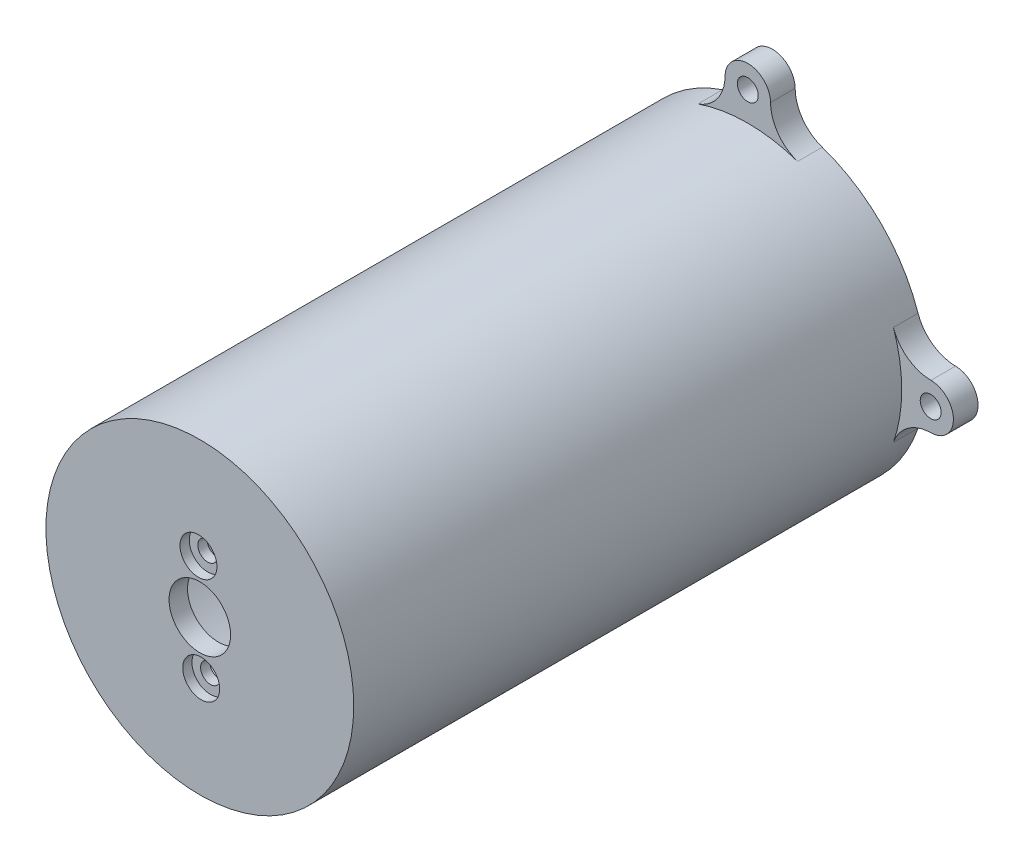
ISO-10303-21;
HEADER;
FILE_DESCRIPTION(('STEP AP214'),'2;1');
FILE_NAME('part.step','',(''),(''),'','','');
FILE_SCHEMA(('AUTOMOTIVE_DESIGN { 1 0 10303 214 1 1 1 1 }'));
ENDSEC;
DATA;
#1=APPLICATION_CONTEXT('core data for automotive mechanical design processes');
#2=APPLICATION_PROTOCOL_DEFINITION('international standard','automotive_design',2000,#1);
#3=PRODUCT_CONTEXT('',#1,'mechanical');
#4=PRODUCT('Part','Part','',(#3));
#5=PRODUCT_RELATED_PRODUCT_CATEGORY('part','',(#4));
#6=PRODUCT_DEFINITION_FORMATION('','',#4);
#7=PRODUCT_DEFINITION_CONTEXT('part definition',#1,'design');
#8=PRODUCT_DEFINITION('design','',#6,#7);
#9=PRODUCT_DEFINITION_SHAPE('','',#8);
#10=(LENGTH_UNIT() NAMED_UNIT(*) SI_UNIT(.MILLI.,.METRE.));
#11=(NAMED_UNIT(*) PLANE_ANGLE_UNIT() SI_UNIT($,.RADIAN.));
#12=(NAMED_UNIT(*) SI_UNIT($,.STERADIAN.) SOLID_ANGLE_UNIT());
#13=UNCERTAINTY_MEASURE_WITH_UNIT(LENGTH_MEASURE(1.E-05),#10,'distance_accuracy_value','');
#14=(GEOMETRIC_REPRESENTATION_CONTEXT(3) GLOBAL_UNCERTAINTY_ASSIGNED_CONTEXT((#13)) GLOBAL_UNIT_ASSIGNED_CONTEXT((#10,
#11,#12)) REPRESENTATION_CONTEXT('',''));
#15=CARTESIAN_POINT('',(0.,0.,0.));
#16=DIRECTION('',(0.,0.,1.));
#17=DIRECTION('',(1.,0.,0.));
#18=AXIS2_PLACEMENT_3D('',#15,#16,#17);
#19=CARTESIAN_POINT('',(0.222147672715695,-8.49709658715891,93.));
#20=DIRECTION('',(0.,0.,-1.));
#21=DIRECTION('',(-1.,0.,0.));
#22=AXIS2_PLACEMENT_3D('',#19,#20,#21);
#23=CYLINDRICAL_SURFACE('',#22,1.60000000000014);
#24=CARTESIAN_POINT('',(0.222147672715695,-8.49709658715891,90.));
#25=DIRECTION('',(0.,0.,1.));
#26=DIRECTION('',(1.,0.,0.));
#27=AXIS2_PLACEMENT_3D('',#24,#25,#26);
#28=CIRCLE('',#27,1.60000000000014);
#29=CARTESIAN_POINT('',(1.82214767271583,-8.49709658715891,90.));
#30=VERTEX_POINT('',#29);
#31=EDGE_CURVE('E297',#30,#30,#28,.T.);
#32=ORIENTED_EDGE('',*,*,#31,.F.);
#33=EDGE_LOOP('',(#32));
#34=FACE_BOUND('',#33,.T.);
#35=CARTESIAN_POINT('',(0.222147672715695,-8.49709658715891,91.5));
#36=DIRECTION('',(0.,0.,1.));
#37=DIRECTION('',(1.,0.,0.));
#38=AXIS2_PLACEMENT_3D('',#35,#36,#37);
#39=CIRCLE('',#38,1.60000000000014);
#40=CARTESIAN_POINT('',(1.82214767271583,-8.49709658715891,91.5));
#41=VERTEX_POINT('',#40);
#42=EDGE_CURVE('E43',#41,#41,#39,.T.);
#43=ORIENTED_EDGE('',*,*,#42,.T.);
#44=EDGE_LOOP('',(#43));
#45=FACE_BOUND('',#44,.T.);
#46=ADVANCED_FACE('F39',(#34,#45),#23,.F.);
#47=CARTESIAN_POINT('',(-0.222147672715639,8.49709658715891,93.));
#48=DIRECTION('',(0.,0.,-1.));
#49=DIRECTION('',(-1.,0.,0.));
#50=AXIS2_PLACEMENT_3D('',#47,#48,#49);
#51=CYLINDRICAL_SURFACE('',#50,1.60000000000014);
#52=CARTESIAN_POINT('',(-0.222147672715639,8.49709658715891,90.));
#53=DIRECTION('',(0.,0.,1.));
#54=DIRECTION('',(1.,0.,0.));
#55=AXIS2_PLACEMENT_3D('',#52,#53,#54);
#56=CIRCLE('',#55,1.60000000000014);
#57=CARTESIAN_POINT('',(1.3778523272845,8.49709658715891,90.));
#58=VERTEX_POINT('',#57);
#59=EDGE_CURVE('E294',#58,#58,#56,.T.);
#60=ORIENTED_EDGE('',*,*,#59,.F.);
#61=EDGE_LOOP('',(#60));
#62=FACE_BOUND('',#61,.T.);
#63=CARTESIAN_POINT('',(-0.222147672715639,8.49709658715891,91.5));
#64=DIRECTION('',(0.,0.,1.));
#65=DIRECTION('',(1.,0.,0.));
#66=AXIS2_PLACEMENT_3D('',#63,#64,#65);
#67=CIRCLE('',#66,1.60000000000014);
#68=CARTESIAN_POINT('',(1.3778523272845,8.49709658715891,91.5));
#69=VERTEX_POINT('',#68);
#70=EDGE_CURVE('E284',#69,#69,#67,.T.);
#71=ORIENTED_EDGE('',*,*,#70,.T.);
#72=EDGE_LOOP('',(#71));
#73=FACE_BOUND('',#72,.T.);
#74=ADVANCED_FACE('F369',(#62,#73),#51,.F.);
#75=CARTESIAN_POINT('',(0.,0.,0.));
#76=DIRECTION('',(0.,0.,1.));
#77=DIRECTION('',(1.,0.,0.));
#78=AXIS2_PLACEMENT_3D('',#75,#76,#77);
#79=PLANE('',#78);
#80=CARTESIAN_POINT('',(0.,0.,0.));
#81=DIRECTION('',(0.,0.,1.));
#82=DIRECTION('',(1.,0.,0.));
#83=AXIS2_PLACEMENT_3D('',#80,#81,#82);
#84=CIRCLE('',#83,25.);
#85=CARTESIAN_POINT('',(23.6554109952273,8.08835772248491,0.));
#86=VERTEX_POINT('',#85);
#87=CARTESIAN_POINT('',(8.08835772248466,23.6554109952273,0.));
#88=VERTEX_POINT('',#87);
#89=EDGE_CURVE('E11',#86,#88,#84,.T.);
#90=ORIENTED_EDGE('',*,*,#89,.F.);
#91=CARTESIAN_POINT('',(29.8058178539863,10.191330730331,0.));
#92=DIRECTION('',(0.,0.,1.));
#93=DIRECTION('',(-1.,0.,0.));
#94=AXIS2_PLACEMENT_3D('',#91,#92,#93);
#95=CIRCLE('',#94,6.5);
#96=CARTESIAN_POINT('',(29.7425959776503,3.69163819957597,0.));
#97=VERTEX_POINT('',#96);
#98=EDGE_CURVE('E240',#86,#97,#95,.T.);
#99=ORIENTED_EDGE('',*,*,#98,.T.);
#100=CARTESIAN_POINT('',(29.706687772358,1.03720345996027E-13,0.));
#101=DIRECTION('',(0.,0.,-1.));
#102=DIRECTION('',(-1.,0.,0.));
#103=AXIS2_PLACEMENT_3D('',#100,#101,#102);
#104=CIRCLE('',#103,3.69181283325347);
#105=CARTESIAN_POINT('',(29.7425959776503,-3.69163819957576,0.));
#106=VERTEX_POINT('',#105);
#107=EDGE_CURVE('E182',#97,#106,#104,.T.);
#108=ORIENTED_EDGE('',*,*,#107,.T.);
#109=CARTESIAN_POINT('',(29.8058178539864,-10.1913307303308,0.));
#110=DIRECTION('',(0.,0.,1.));
#111=DIRECTION('',(1.,0.,0.));
#112=AXIS2_PLACEMENT_3D('',#109,#110,#111);
#113=CIRCLE('',#112,6.5);
#114=CARTESIAN_POINT('',(23.6554109952273,-8.08835772248474,0.));
#115=VERTEX_POINT('',#114);
#116=EDGE_CURVE('E179',#106,#115,#113,.T.);
#117=ORIENTED_EDGE('',*,*,#116,.T.);
#118=CARTESIAN_POINT('',(8.08835772248484,-23.6554109952273,0.));
#119=VERTEX_POINT('',#118);
#120=EDGE_CURVE('E50',#119,#115,#84,.T.);
#121=ORIENTED_EDGE('',*,*,#120,.F.);
#122=CARTESIAN_POINT('',(10.1913307303309,-29.8058178539864,0.));
#123=DIRECTION('',(0.,0.,1.));
#124=DIRECTION('',(-1.,0.,0.));
#125=AXIS2_PLACEMENT_3D('',#122,#123,#124);
#126=CIRCLE('',#125,6.5);
#127=CARTESIAN_POINT('',(3.69163819957586,-29.7425959776503,0.));
#128=VERTEX_POINT('',#127);
#129=EDGE_CURVE('E215',#119,#128,#126,.T.);
#130=ORIENTED_EDGE('',*,*,#129,.T.);
#131=CARTESIAN_POINT('',(0.,-29.706687772358,0.));
#132=DIRECTION('',(0.,0.,-1.));
#133=DIRECTION('',(-1.,0.,0.));
#134=AXIS2_PLACEMENT_3D('',#131,#132,#133);
#135=CIRCLE('',#134,3.69181283325347);
#136=CARTESIAN_POINT('',(-3.69163819957586,-29.7425959776503,0.));
#137=VERTEX_POINT('',#136);
#138=EDGE_CURVE('E158',#128,#137,#135,.T.);
#139=ORIENTED_EDGE('',*,*,#138,.T.);
#140=CARTESIAN_POINT('',(-10.1913307303309,-29.8058178539864,0.));
#141=DIRECTION('',(0.,0.,1.));
#142=DIRECTION('',(1.,0.,0.));
#143=AXIS2_PLACEMENT_3D('',#140,#141,#142);
#144=CIRCLE('',#143,6.5);
#145=CARTESIAN_POINT('',(-8.08835772248483,-23.6554109952273,0.));
#146=VERTEX_POINT('',#145);
#147=EDGE_CURVE('E219',#137,#146,#144,.T.);
#148=ORIENTED_EDGE('',*,*,#147,.T.);
#149=CARTESIAN_POINT('',(-23.6554109952272,-8.08835772248509,0.));
#150=VERTEX_POINT('',#149);
#151=EDGE_CURVE('E505',#150,#146,#84,.T.);
#152=ORIENTED_EDGE('',*,*,#151,.F.);
#153=CARTESIAN_POINT('',(-29.8058178539863,-10.1913307303312,0.));
#154=DIRECTION('',(0.,0.,1.));
#155=DIRECTION('',(-1.,0.,0.));
#156=AXIS2_PLACEMENT_3D('',#153,#154,#155);
#157=CIRCLE('',#156,6.5);
#158=CARTESIAN_POINT('',(-29.7425959776502,-3.69163819957619,0.));
#159=VERTEX_POINT('',#158);
#160=EDGE_CURVE('E222',#150,#159,#157,.T.);
#161=ORIENTED_EDGE('',*,*,#160,.T.);
#162=CARTESIAN_POINT('',(-29.706687772358,-3.18099931891989E-13,0.));
#163=DIRECTION('',(0.,0.,-1.));
#164=DIRECTION('',(-1.,0.,0.));
#165=AXIS2_PLACEMENT_3D('',#162,#163,#164);
#166=CIRCLE('',#165,3.69181283325347);
#167=CARTESIAN_POINT('',(-29.7425959776503,3.69163819957555,0.));
#168=VERTEX_POINT('',#167);
#169=EDGE_CURVE('E225',#159,#168,#166,.T.);
#170=ORIENTED_EDGE('',*,*,#169,.T.);
#171=CARTESIAN_POINT('',(-29.8058178539865,10.1913307303306,0.));
#172=DIRECTION('',(0.,0.,1.));
#173=DIRECTION('',(1.,0.,0.));
#174=AXIS2_PLACEMENT_3D('',#171,#172,#173);
#175=CIRCLE('',#174,6.5);
#176=CARTESIAN_POINT('',(-23.6554109952274,8.08835772248457,0.));
#177=VERTEX_POINT('',#176);
#178=EDGE_CURVE('E228',#168,#177,#175,.T.);
#179=ORIENTED_EDGE('',*,*,#178,.T.);
#180=CARTESIAN_POINT('',(-8.08835772248499,23.6554109952272,0.));
#181=VERTEX_POINT('',#180);
#182=EDGE_CURVE('E48',#181,#177,#84,.T.);
#183=ORIENTED_EDGE('',*,*,#182,.F.);
#184=CARTESIAN_POINT('',(-10.1913307303311,29.8058178539863,0.));
#185=DIRECTION('',(0.,0.,1.));
#186=DIRECTION('',(-1.,0.,0.));
#187=AXIS2_PLACEMENT_3D('',#184,#185,#186);
#188=CIRCLE('',#187,6.5);
#189=CARTESIAN_POINT('',(-3.69163819957607,29.7425959776502,0.));
#190=VERTEX_POINT('',#189);
#191=EDGE_CURVE('E231',#181,#190,#188,.T.);
#192=ORIENTED_EDGE('',*,*,#191,.T.);
#193=CARTESIAN_POINT('',(-2.03971245040101E-13,29.706687772358,0.));
#194=DIRECTION('',(0.,0.,-1.));
#195=DIRECTION('',(-1.,0.,0.));
#196=AXIS2_PLACEMENT_3D('',#193,#194,#195);
#197=CIRCLE('',#196,3.69181283325347);
#198=CARTESIAN_POINT('',(3.69163819957566,29.7425959776503,0.));
#199=VERTEX_POINT('',#198);
#200=EDGE_CURVE('E234',#190,#199,#197,.T.);
#201=ORIENTED_EDGE('',*,*,#200,.T.);
#202=CARTESIAN_POINT('',(10.1913307303307,29.8058178539865,0.));
#203=DIRECTION('',(0.,0.,1.));
#204=DIRECTION('',(1.,0.,0.));
#205=AXIS2_PLACEMENT_3D('',#202,#203,#204);
#206=CIRCLE('',#205,6.5);
#207=EDGE_CURVE('E237',#199,#88,#206,.T.);
#208=ORIENTED_EDGE('',*,*,#207,.T.);
#209=EDGE_LOOP('',(#90,#99,#108,#117,#121,#130,#139,#148,#152,#161,#170,#179,#183,#192,#201,#208));
#210=FACE_BOUND('',#209,.T.);
#211=CARTESIAN_POINT('',(0.,0.,0.));
#212=DIRECTION('',(0.,0.,1.));
#213=DIRECTION('',(1.,0.,0.));
#214=AXIS2_PLACEMENT_3D('',#211,#212,#213);
#215=CIRCLE('',#214,24.);
#216=CARTESIAN_POINT('',(-24.,0.,0.));
#217=VERTEX_POINT('',#216);
#218=EDGE_CURVE('E312',#217,#217,#215,.T.);
#219=ORIENTED_EDGE('',*,*,#218,.T.);
#220=EDGE_LOOP('',(#219));
#221=FACE_BOUND('',#220,.T.);
#222=CARTESIAN_POINT('',(-29.706687772358,-3.18099931891989E-13,0.));
#223=DIRECTION('',(0.,0.,-1.));
#224=DIRECTION('',(-1.,0.,0.));
#225=AXIS2_PLACEMENT_3D('',#222,#223,#224);
#226=CIRCLE('',#225,1.7);
#227=CARTESIAN_POINT('',(-31.406687772358,-3.18099931891989E-13,0.));
#228=VERTEX_POINT('',#227);
#229=EDGE_CURVE('E458',#228,#228,#226,.T.);
#230=ORIENTED_EDGE('',*,*,#229,.F.);
#231=EDGE_LOOP('',(#230));
#232=FACE_BOUND('',#231,.T.);
#233=CARTESIAN_POINT('',(0.,-29.706687772358,0.));
#234=DIRECTION('',(0.,0.,-1.));
#235=DIRECTION('',(-1.,0.,0.));
#236=AXIS2_PLACEMENT_3D('',#233,#234,#235);
#237=CIRCLE('',#236,1.7);
#238=CARTESIAN_POINT('',(-1.7,-29.706687772358,0.));
#239=VERTEX_POINT('',#238);
#240=EDGE_CURVE('E185',#239,#239,#237,.T.);
#241=ORIENTED_EDGE('',*,*,#240,.F.);
#242=EDGE_LOOP('',(#241));
#243=FACE_BOUND('',#242,.T.);
#244=CARTESIAN_POINT('',(29.706687772358,1.03720345996027E-13,0.));
#245=DIRECTION('',(0.,0.,-1.));
#246=DIRECTION('',(-1.,0.,0.));
#247=AXIS2_PLACEMENT_3D('',#244,#245,#246);
#248=CIRCLE('',#247,1.7);
#249=CARTESIAN_POINT('',(28.0066877723579,1.03720345996027E-13,0.));
#250=VERTEX_POINT('',#249);
#251=EDGE_CURVE('E467',#250,#250,#248,.T.);
#252=ORIENTED_EDGE('',*,*,#251,.F.);
#253=EDGE_LOOP('',(#252));
#254=FACE_BOUND('',#253,.T.);
#255=CARTESIAN_POINT('',(-2.03971245040101E-13,29.706687772358,0.));
#256=DIRECTION('',(0.,0.,-1.));
#257=DIRECTION('',(-1.,0.,0.));
#258=AXIS2_PLACEMENT_3D('',#255,#256,#257);
#259=CIRCLE('',#258,1.7);
#260=CARTESIAN_POINT('',(-1.7000000000002,29.706687772358,0.));
#261=VERTEX_POINT('',#260);
#262=EDGE_CURVE('E461',#261,#261,#259,.T.);
#263=ORIENTED_EDGE('',*,*,#262,.F.);
#264=EDGE_LOOP('',(#263));
#265=FACE_BOUND('',#264,.T.);
#266=ADVANCED_FACE('F366',(#210,#221,#232,#243,#254,#265),#79,.F.);
#267=CARTESIAN_POINT('',(0.,0.,90.));
#268=DIRECTION('',(0.,0.,-1.));
#269=DIRECTION('',(-1.,0.,0.));
#270=AXIS2_PLACEMENT_3D('',#267,#268,#269);
#271=CYLINDRICAL_SURFACE('',#270,25.);
#272=DIRECTION('',(0.,0.,-1.));
#273=VECTOR('',#272,1.);
#274=CARTESIAN_POINT('',(-23.6554109952274,8.08835772248457,4.));
#275=LINE('',#274,#273);
#276=CARTESIAN_POINT('',(-23.6554109952274,8.08835772248457,4.));
#277=VERTEX_POINT('',#276);
#278=EDGE_CURVE('E264',#277,#177,#275,.T.);
#279=ORIENTED_EDGE('',*,*,#278,.F.);
#280=CARTESIAN_POINT('',(0.,0.,4.));
#281=DIRECTION('',(0.,0.,-1.));
#282=DIRECTION('',(-1.,0.,0.));
#283=AXIS2_PLACEMENT_3D('',#280,#281,#282);
#284=CIRCLE('',#283,25.);
#285=CARTESIAN_POINT('',(-23.6554109952272,-8.08835772248508,4.));
#286=VERTEX_POINT('',#285);
#287=EDGE_CURVE('E246',#286,#277,#284,.T.);
#288=ORIENTED_EDGE('',*,*,#287,.F.);
#289=DIRECTION('',(0.,0.,-1.));
#290=VECTOR('',#289,1.);
#291=CARTESIAN_POINT('',(-23.6554109952272,-8.08835772248509,4.));
#292=LINE('',#291,#290);
#293=EDGE_CURVE('E271',#286,#150,#292,.T.);
#294=ORIENTED_EDGE('',*,*,#293,.T.);
#295=ORIENTED_EDGE('',*,*,#151,.T.);
#296=DIRECTION('',(0.,0.,-1.));
#297=VECTOR('',#296,1.);
#298=CARTESIAN_POINT('',(-8.08835772248483,-23.6554109952273,4.));
#299=LINE('',#298,#297);
#300=CARTESIAN_POINT('',(-8.08835772248483,-23.6554109952273,4.));
#301=VERTEX_POINT('',#300);
#302=EDGE_CURVE('E274',#301,#146,#299,.T.);
#303=ORIENTED_EDGE('',*,*,#302,.F.);
#304=CARTESIAN_POINT('',(8.08835772248483,-23.6554109952273,4.));
#305=VERTEX_POINT('',#304);
#306=EDGE_CURVE('E280',#305,#301,#284,.T.);
#307=ORIENTED_EDGE('',*,*,#306,.F.);
#308=DIRECTION('',(0.,0.,-1.));
#309=VECTOR('',#308,1.);
#310=CARTESIAN_POINT('',(8.08835772248484,-23.6554109952273,4.));
#311=LINE('',#310,#309);
#312=EDGE_CURVE('E178',#305,#119,#311,.T.);
#313=ORIENTED_EDGE('',*,*,#312,.T.);
#314=ORIENTED_EDGE('',*,*,#120,.T.);
#315=DIRECTION('',(0.,0.,-1.));
#316=VECTOR('',#315,1.);
#317=CARTESIAN_POINT('',(23.6554109952273,-8.08835772248474,4.));
#318=LINE('',#317,#316);
#319=CARTESIAN_POINT('',(23.6554109952273,-8.08835772248474,4.));
#320=VERTEX_POINT('',#319);
#321=EDGE_CURVE('E247',#320,#115,#318,.T.);
#322=ORIENTED_EDGE('',*,*,#321,.F.);
#323=CARTESIAN_POINT('',(23.6554109952273,8.08835772248491,4.));
#324=VERTEX_POINT('',#323);
#325=EDGE_CURVE('E497',#324,#320,#284,.T.);
#326=ORIENTED_EDGE('',*,*,#325,.F.);
#327=DIRECTION('',(0.,0.,-1.));
#328=VECTOR('',#327,1.);
#329=CARTESIAN_POINT('',(23.6554109952273,8.08835772248491,4.));
#330=LINE('',#329,#328);
#331=EDGE_CURVE('E254',#324,#86,#330,.T.);
#332=ORIENTED_EDGE('',*,*,#331,.T.);
#333=ORIENTED_EDGE('',*,*,#89,.T.);
#334=DIRECTION('',(0.,0.,-1.));
#335=VECTOR('',#334,1.);
#336=CARTESIAN_POINT('',(8.08835772248467,23.6554109952273,4.));
#337=LINE('',#336,#335);
#338=CARTESIAN_POINT('',(8.08835772248467,23.6554109952273,4.));
#339=VERTEX_POINT('',#338);
#340=EDGE_CURVE('E61',#339,#88,#337,.T.);
#341=ORIENTED_EDGE('',*,*,#340,.F.);
#342=CARTESIAN_POINT('',(-8.08835772248499,23.6554109952272,4.));
#343=VERTEX_POINT('',#342);
#344=EDGE_CURVE('E57',#343,#339,#284,.T.);
#345=ORIENTED_EDGE('',*,*,#344,.F.);
#346=DIRECTION('',(0.,0.,-1.));
#347=VECTOR('',#346,1.);
#348=CARTESIAN_POINT('',(-8.08835772248499,23.6554109952272,4.));
#349=LINE('',#348,#347);
#350=EDGE_CURVE('E262',#343,#181,#349,.T.);
#351=ORIENTED_EDGE('',*,*,#350,.T.);
#352=ORIENTED_EDGE('',*,*,#182,.T.);
#353=EDGE_LOOP('',(#279,#288,#294,#295,#303,#307,#313,#314,#322,#326,#332,#333,#341,#345,#351,#352));
#354=FACE_BOUND('',#353,.T.);
#355=CARTESIAN_POINT('',(0.,0.,93.));
#356=DIRECTION('',(0.,0.,1.));
#357=DIRECTION('',(1.,0.,0.));
#358=AXIS2_PLACEMENT_3D('',#355,#356,#357);
#359=CIRCLE('',#358,25.);
#360=CARTESIAN_POINT('',(25.,0.,93.));
#361=VERTEX_POINT('',#360);
#362=EDGE_CURVE('E304',#361,#361,#359,.T.);
#363=ORIENTED_EDGE('',*,*,#362,.F.);
#364=EDGE_LOOP('',(#363));
#365=FACE_BOUND('',#364,.T.);
#366=ADVANCED_FACE('F41',(#354,#365),#271,.T.);
#367=CARTESIAN_POINT('',(0.,0.,90.));
#368=DIRECTION('',(0.,0.,-1.));
#369=DIRECTION('',(-1.,0.,0.));
#370=AXIS2_PLACEMENT_3D('',#367,#368,#369);
#371=CYLINDRICAL_SURFACE('',#370,24.);
#372=CARTESIAN_POINT('',(0.,0.,90.));
#373=DIRECTION('',(0.,0.,1.));
#374=DIRECTION('',(1.,0.,0.));
#375=AXIS2_PLACEMENT_3D('',#372,#373,#374);
#376=CIRCLE('',#375,24.);
#377=CARTESIAN_POINT('',(-24.,0.,90.));
#378=VERTEX_POINT('',#377);
#379=EDGE_CURVE('E309',#378,#378,#376,.T.);
#380=CARTESIAN_POINT('',(-24.,0.,0.));
#381=CARTESIAN_POINT('',(-24.,0.,0.937499999999986));
#382=CARTESIAN_POINT('',(-24.,0.,1.87499999999998));
#383=CARTESIAN_POINT('',(-24.,0.,3.74999999999998));
#384=CARTESIAN_POINT('',(-24.,0.,4.68749999999999));
#385=CARTESIAN_POINT('',(-24.,0.,6.56249999999999));
#386=CARTESIAN_POINT('',(-24.,0.,7.49999999999999));
#387=CARTESIAN_POINT('',(-24.,0.,9.37499999999999));
#388=CARTESIAN_POINT('',(-24.,0.,10.3125));
#389=CARTESIAN_POINT('',(-24.,0.,12.1875));
#390=CARTESIAN_POINT('',(-24.,0.,13.125));
#391=CARTESIAN_POINT('',(-24.,0.,15.));
#392=CARTESIAN_POINT('',(-24.,0.,15.9375));
#393=CARTESIAN_POINT('',(-24.,0.,17.8125));
#394=CARTESIAN_POINT('',(-24.,0.,18.75));
#395=CARTESIAN_POINT('',(-24.,0.,20.625));
#396=CARTESIAN_POINT('',(-24.,0.,21.5625));
#397=CARTESIAN_POINT('',(-24.,0.,23.4375));
#398=CARTESIAN_POINT('',(-24.,0.,24.375));
#399=CARTESIAN_POINT('',(-24.,0.,26.25));
#400=CARTESIAN_POINT('',(-24.,0.,27.1875));
#401=CARTESIAN_POINT('',(-24.,0.,29.0625));
#402=CARTESIAN_POINT('',(-24.,0.,30.));
#403=CARTESIAN_POINT('',(-24.,0.,31.875));
#404=CARTESIAN_POINT('',(-24.,0.,32.8125));
#405=CARTESIAN_POINT('',(-24.,0.,34.6875));
#406=CARTESIAN_POINT('',(-24.,0.,35.625));
#407=CARTESIAN_POINT('',(-24.,0.,37.5));
#408=CARTESIAN_POINT('',(-24.,0.,38.4375));
#409=CARTESIAN_POINT('',(-24.,0.,40.3125));
#410=CARTESIAN_POINT('',(-24.,0.,41.25));
#411=CARTESIAN_POINT('',(-24.,0.,43.125));
#412=CARTESIAN_POINT('',(-24.,0.,44.0625));
#413=CARTESIAN_POINT('',(-24.,0.,45.9375));
#414=CARTESIAN_POINT('',(-24.,0.,46.875));
#415=CARTESIAN_POINT('',(-24.,0.,48.75));
#416=CARTESIAN_POINT('',(-24.,0.,49.6875));
#417=CARTESIAN_POINT('',(-24.,0.,51.5625));
#418=CARTESIAN_POINT('',(-24.,0.,52.5));
#419=CARTESIAN_POINT('',(-24.,0.,54.375));
#420=CARTESIAN_POINT('',(-24.,0.,55.3125));
#421=CARTESIAN_POINT('',(-24.,0.,57.1875));
#422=CARTESIAN_POINT('',(-24.,0.,58.125));
#423=CARTESIAN_POINT('',(-24.,0.,60.));
#424=CARTESIAN_POINT('',(-24.,0.,60.9375));
#425=CARTESIAN_POINT('',(-24.,0.,62.8125));
#426=CARTESIAN_POINT('',(-24.,0.,63.75));
#427=CARTESIAN_POINT('',(-24.,0.,65.625));
#428=CARTESIAN_POINT('',(-24.,0.,66.5625));
#429=CARTESIAN_POINT('',(-24.,0.,68.4375));
#430=CARTESIAN_POINT('',(-24.,0.,69.375));
#431=CARTESIAN_POINT('',(-24.,0.,71.25));
#432=CARTESIAN_POINT('',(-24.,0.,72.1875));
#433=CARTESIAN_POINT('',(-24.,0.,74.0625));
#434=CARTESIAN_POINT('',(-24.,0.,75.));
#435=CARTESIAN_POINT('',(-24.,0.,76.875));
#436=CARTESIAN_POINT('',(-24.,0.,77.8125));
#437=CARTESIAN_POINT('',(-24.,0.,79.6875));
#438=CARTESIAN_POINT('',(-24.,0.,80.625));
#439=CARTESIAN_POINT('',(-24.,0.,82.5));
#440=CARTESIAN_POINT('',(-24.,0.,83.4375));
#441=CARTESIAN_POINT('',(-24.,0.,85.3125));
#442=CARTESIAN_POINT('',(-24.,0.,86.25));
#443=CARTESIAN_POINT('',(-24.,0.,88.125));
#444=CARTESIAN_POINT('',(-24.,0.,89.0625));
#445=CARTESIAN_POINT('',(-24.,0.,90.));
#446=B_SPLINE_CURVE_WITH_KNOTS('',3,(#380,#381,#382,#383,#384,#385,#386,#387,#388,#389,#390,
#391,#392,#393,#394,#395,#396,#397,#398,#399,#400,#401,#402,#403,#404,#405,#406,#407,#408,#409,
#410,#411,#412,#413,#414,#415,#416,#417,#418,#419,#420,#421,#422,#423,#424,#425,#426,#427,#428,
#429,#430,#431,#432,#433,#434,#435,#436,#437,#438,#439,#440,#441,#442,#443,#444,#445),
.UNSPECIFIED.,.F.,.F.,(4,2,2,2,2,2,2,2,2,2,2,2,2,2,2,2,2,2,2,2,2,2,2,2,2,2,2,2,2,2,2,2,4),(0.,
2.8125,5.62500000000001,8.4375,11.25,14.0625,16.875,19.6875,22.5,25.3125,28.125,30.9375,33.75,
36.5625,39.375,42.1875,45.,47.8125,50.625,53.4375,56.25,59.0625,61.875,64.6875,67.5,70.3125,
73.125,75.9375,78.75,81.5625,84.375,87.1875,90.),.UNSPECIFIED.);
#447=EDGE_CURVE('BSEAM354',#217,#378,#446,.T.);
#448=ORIENTED_EDGE('',*,*,#218,.F.);
#449=ORIENTED_EDGE('',*,*,#379,.T.);
#450=ORIENTED_EDGE('',*,*,#447,.T.);
#451=ORIENTED_EDGE('',*,*,#447,.F.);
#452=EDGE_LOOP('',(#448,#450,#449,#451));
#453=FACE_BOUND('',#452,.T.);
#454=ADVANCED_FACE('F354',(#453),#371,.F.);
#455=CARTESIAN_POINT('',(0.,0.,90.));
#456=DIRECTION('',(0.,0.,1.));
#457=DIRECTION('',(1.,0.,0.));
#458=AXIS2_PLACEMENT_3D('',#455,#456,#457);
#459=PLANE('',#458);
#460=ORIENTED_EDGE('',*,*,#59,.T.);
#461=EDGE_LOOP('',(#460));
#462=FACE_BOUND('',#461,.T.);
#463=ORIENTED_EDGE('',*,*,#31,.T.);
#464=EDGE_LOOP('',(#463));
#465=FACE_BOUND('',#464,.T.);
#466=CARTESIAN_POINT('',(0.,0.,90.));
#467=DIRECTION('',(0.,0.,1.));
#468=DIRECTION('',(1.,0.,0.));
#469=AXIS2_PLACEMENT_3D('',#466,#467,#468);
#470=CIRCLE('',#469,5.);
#471=CARTESIAN_POINT('',(5.00000000000003,0.,90.));
#472=VERTEX_POINT('',#471);
#473=EDGE_CURVE('E300',#472,#472,#470,.T.);
#474=ORIENTED_EDGE('',*,*,#473,.T.);
#475=EDGE_LOOP('',(#474));
#476=FACE_BOUND('',#475,.T.);
#477=ORIENTED_EDGE('',*,*,#379,.F.);
#478=EDGE_LOOP('',(#477));
#479=FACE_BOUND('',#478,.T.);
#480=ADVANCED_FACE('F339',(#462,#465,#476,#479),#459,.F.);
#481=CARTESIAN_POINT('',(0.,0.,93.));
#482=DIRECTION('',(0.,0.,1.));
#483=DIRECTION('',(1.,0.,0.));
#484=AXIS2_PLACEMENT_3D('',#481,#482,#483);
#485=PLANE('',#484);
#486=CARTESIAN_POINT('',(-0.222147672715639,8.49709658715891,93.));
#487=DIRECTION('',(0.,0.,1.));
#488=DIRECTION('',(1.,0.,0.));
#489=AXIS2_PLACEMENT_3D('',#486,#487,#488);
#490=CIRCLE('',#489,3.);
#491=CARTESIAN_POINT('',(2.77785232728436,8.49709658715891,93.));
#492=VERTEX_POINT('',#491);
#493=EDGE_CURVE('E285',#492,#492,#490,.T.);
#494=ORIENTED_EDGE('',*,*,#493,.F.);
#495=EDGE_LOOP('',(#494));
#496=FACE_BOUND('',#495,.T.);
#497=CARTESIAN_POINT('',(0.222147672715695,-8.49709658715891,93.));
#498=DIRECTION('',(0.,0.,1.));
#499=DIRECTION('',(1.,0.,0.));
#500=AXIS2_PLACEMENT_3D('',#497,#498,#499);
#501=CIRCLE('',#500,3.);
#502=CARTESIAN_POINT('',(3.22214767271569,-8.49709658715891,93.));
#503=VERTEX_POINT('',#502);
#504=EDGE_CURVE('E288',#503,#503,#501,.T.);
#505=ORIENTED_EDGE('',*,*,#504,.F.);
#506=EDGE_LOOP('',(#505));
#507=FACE_BOUND('',#506,.T.);
#508=ORIENTED_EDGE('',*,*,#362,.T.);
#509=EDGE_LOOP('',(#508));
#510=FACE_BOUND('',#509,.T.);
#511=CARTESIAN_POINT('',(0.,0.,93.));
#512=DIRECTION('',(0.,0.,1.));
#513=DIRECTION('',(1.,0.,0.));
#514=AXIS2_PLACEMENT_3D('',#511,#512,#513);
#515=CIRCLE('',#514,5.);
#516=CARTESIAN_POINT('',(5.00000000000003,0.,93.));
#517=VERTEX_POINT('',#516);
#518=EDGE_CURVE('E301',#517,#517,#515,.T.);
#519=ORIENTED_EDGE('',*,*,#518,.F.);
#520=EDGE_LOOP('',(#519));
#521=FACE_BOUND('',#520,.T.);
#522=ADVANCED_FACE('F335',(#496,#507,#510,#521),#485,.T.);
#523=CARTESIAN_POINT('',(0.,0.,93.));
#524=DIRECTION('',(0.,0.,-1.));
#525=DIRECTION('',(-1.,0.,0.));
#526=AXIS2_PLACEMENT_3D('',#523,#524,#525);
#527=CYLINDRICAL_SURFACE('',#526,5.);
#528=ORIENTED_EDGE('',*,*,#518,.T.);
#529=EDGE_LOOP('',(#528));
#530=FACE_BOUND('',#529,.T.);
#531=ORIENTED_EDGE('',*,*,#473,.F.);
#532=EDGE_LOOP('',(#531));
#533=FACE_BOUND('',#532,.T.);
#534=ADVANCED_FACE('F338',(#530,#533),#527,.F.);
#535=CARTESIAN_POINT('',(-0.222147672715639,8.49709658715891,91.5));
#536=DIRECTION('',(0.,0.,1.));
#537=DIRECTION('',(1.,0.,0.));
#538=AXIS2_PLACEMENT_3D('',#535,#536,#537);
#539=CYLINDRICAL_SURFACE('',#538,3.);
#540=CARTESIAN_POINT('',(-0.222147672715639,8.49709658715891,91.5));
#541=DIRECTION('',(0.,0.,1.));
#542=DIRECTION('',(1.,0.,0.));
#543=AXIS2_PLACEMENT_3D('',#540,#541,#542);
#544=CIRCLE('',#543,3.);
#545=CARTESIAN_POINT('',(2.77785232728436,8.49709658715891,91.5));
#546=VERTEX_POINT('',#545);
#547=EDGE_CURVE('E281',#546,#546,#544,.T.);
#548=ORIENTED_EDGE('',*,*,#547,.F.);
#549=EDGE_LOOP('',(#548));
#550=FACE_BOUND('',#549,.T.);
#551=ORIENTED_EDGE('',*,*,#493,.T.);
#552=EDGE_LOOP('',(#551));
#553=FACE_BOUND('',#552,.T.);
#554=ADVANCED_FACE('F348',(#550,#553),#539,.F.);
#555=CARTESIAN_POINT('',(-0.222147672715639,8.49709658715891,91.5));
#556=DIRECTION('',(0.,0.,1.));
#557=DIRECTION('',(1.,0.,0.));
#558=AXIS2_PLACEMENT_3D('',#555,#556,#557);
#559=PLANE('',#558);
#560=ORIENTED_EDGE('',*,*,#70,.F.);
#561=EDGE_LOOP('',(#560));
#562=FACE_BOUND('',#561,.T.);
#563=ORIENTED_EDGE('',*,*,#547,.T.);
#564=EDGE_LOOP('',(#563));
#565=FACE_BOUND('',#564,.T.);
#566=ADVANCED_FACE('F331',(#562,#565),#559,.T.);
#567=CARTESIAN_POINT('',(0.222147672715695,-8.49709658715891,91.5));
#568=DIRECTION('',(0.,0.,1.));
#569=DIRECTION('',(1.,0.,0.));
#570=AXIS2_PLACEMENT_3D('',#567,#568,#569);
#571=CYLINDRICAL_SURFACE('',#570,3.);
#572=CARTESIAN_POINT('',(0.222147672715695,-8.49709658715891,91.5));
#573=DIRECTION('',(0.,0.,1.));
#574=DIRECTION('',(1.,0.,0.));
#575=AXIS2_PLACEMENT_3D('',#572,#573,#574);
#576=CIRCLE('',#575,3.);
#577=CARTESIAN_POINT('',(3.22214767271569,-8.49709658715891,91.5));
#578=VERTEX_POINT('',#577);
#579=EDGE_CURVE('E291',#578,#578,#576,.T.);
#580=ORIENTED_EDGE('',*,*,#579,.F.);
#581=EDGE_LOOP('',(#580));
#582=FACE_BOUND('',#581,.T.);
#583=ORIENTED_EDGE('',*,*,#504,.T.);
#584=EDGE_LOOP('',(#583));
#585=FACE_BOUND('',#584,.T.);
#586=ADVANCED_FACE('F325',(#582,#585),#571,.F.);
#587=CARTESIAN_POINT('',(0.222147672715695,-8.49709658715891,91.5));
#588=DIRECTION('',(0.,0.,1.));
#589=DIRECTION('',(1.,0.,0.));
#590=AXIS2_PLACEMENT_3D('',#587,#588,#589);
#591=PLANE('',#590);
#592=ORIENTED_EDGE('',*,*,#42,.F.);
#593=EDGE_LOOP('',(#592));
#594=FACE_BOUND('',#593,.T.);
#595=ORIENTED_EDGE('',*,*,#579,.T.);
#596=EDGE_LOOP('',(#595));
#597=FACE_BOUND('',#596,.T.);
#598=ADVANCED_FACE('F321',(#594,#597),#591,.T.);
#599=CARTESIAN_POINT('',(-29.706687772358,-3.18099931891989E-13,4.));
#600=DIRECTION('',(0.,0.,-1.));
#601=DIRECTION('',(-1.,0.,0.));
#602=AXIS2_PLACEMENT_3D('',#599,#600,#601);
#603=CYLINDRICAL_SURFACE('',#602,3.69181283325347);
#604=ORIENTED_EDGE('',*,*,#169,.F.);
#605=DIRECTION('',(0.,0.,-1.));
#606=VECTOR('',#605,1.);
#607=CARTESIAN_POINT('',(-29.7425959776502,-3.69163819957619,4.));
#608=LINE('',#607,#606);
#609=CARTESIAN_POINT('',(-29.7425959776502,-3.69163819957619,4.));
#610=VERTEX_POINT('',#609);
#611=EDGE_CURVE('E269',#610,#159,#608,.T.);
#612=ORIENTED_EDGE('',*,*,#611,.F.);
#613=CARTESIAN_POINT('',(-29.706687772358,-3.18099931891989E-13,4.));
#614=DIRECTION('',(0.,0.,-1.));
#615=DIRECTION('',(-1.,0.,0.));
#616=AXIS2_PLACEMENT_3D('',#613,#614,#615);
#617=CIRCLE('',#616,3.69181283325347);
#618=CARTESIAN_POINT('',(-29.7425959776503,3.69163819957555,4.));
#619=VERTEX_POINT('',#618);
#620=EDGE_CURVE('E192',#610,#619,#617,.T.);
#621=ORIENTED_EDGE('',*,*,#620,.T.);
#622=DIRECTION('',(0.,0.,-1.));
#623=VECTOR('',#622,1.);
#624=CARTESIAN_POINT('',(-29.7425959776503,3.69163819957555,4.));
#625=LINE('',#624,#623);
#626=EDGE_CURVE('E267',#619,#168,#625,.T.);
#627=ORIENTED_EDGE('',*,*,#626,.T.);
#628=EDGE_LOOP('',(#604,#612,#621,#627));
#629=FACE_BOUND('',#628,.T.);
#630=ADVANCED_FACE('F324',(#629),#603,.T.);
#631=CARTESIAN_POINT('',(-29.706687772358,-3.18099931891989E-13,4.));
#632=DIRECTION('',(0.,0.,-1.));
#633=DIRECTION('',(-1.,0.,0.));
#634=AXIS2_PLACEMENT_3D('',#631,#632,#633);
#635=CYLINDRICAL_SURFACE('',#634,1.7);
#636=CARTESIAN_POINT('',(-29.706687772358,-3.18099931891989E-13,4.));
#637=DIRECTION('',(0.,0.,-1.));
#638=DIRECTION('',(-1.,0.,0.));
#639=AXIS2_PLACEMENT_3D('',#636,#637,#638);
#640=CIRCLE('',#639,1.7);
#641=CARTESIAN_POINT('',(-31.406687772358,-3.18099931891989E-13,4.));
#642=VERTEX_POINT('',#641);
#643=EDGE_CURVE('E455',#642,#642,#640,.T.);
#644=ORIENTED_EDGE('',*,*,#643,.F.);
#645=EDGE_LOOP('',(#644));
#646=FACE_BOUND('',#645,.T.);
#647=ORIENTED_EDGE('',*,*,#229,.T.);
#648=EDGE_LOOP('',(#647));
#649=FACE_BOUND('',#648,.T.);
#650=ADVANCED_FACE('F402',(#646,#649),#635,.F.);
#651=CARTESIAN_POINT('',(5.09566536516544,-14.9029089269932,4.));
#652=DIRECTION('',(0.,0.,-1.));
#653=DIRECTION('',(-1.,0.,0.));
#654=AXIS2_PLACEMENT_3D('',#651,#652,#653);
#655=PLANE('',#654);
#656=ORIENTED_EDGE('',*,*,#643,.T.);
#657=EDGE_LOOP('',(#656));
#658=FACE_BOUND('',#657,.T.);
#659=CARTESIAN_POINT('',(-29.8058178539863,-10.1913307303312,4.));
#660=DIRECTION('',(0.,0.,1.));
#661=DIRECTION('',(-1.,0.,0.));
#662=AXIS2_PLACEMENT_3D('',#659,#660,#661);
#663=CIRCLE('',#662,6.5);
#664=EDGE_CURVE('E189',#286,#610,#663,.T.);
#665=ORIENTED_EDGE('',*,*,#664,.F.);
#666=ORIENTED_EDGE('',*,*,#287,.T.);
#667=CARTESIAN_POINT('',(-29.8058178539865,10.1913307303306,4.));
#668=DIRECTION('',(0.,0.,1.));
#669=DIRECTION('',(1.,0.,0.));
#670=AXIS2_PLACEMENT_3D('',#667,#668,#669);
#671=CIRCLE('',#670,6.5);
#672=EDGE_CURVE('E195',#619,#277,#671,.T.);
#673=ORIENTED_EDGE('',*,*,#672,.F.);
#674=ORIENTED_EDGE('',*,*,#620,.F.);
#675=EDGE_LOOP('',(#665,#666,#673,#674));
#676=FACE_BOUND('',#675,.T.);
#677=ADVANCED_FACE('F399',(#658,#676),#655,.F.);
#678=CARTESIAN_POINT('',(-29.8058178539863,-10.1913307303312,4.));
#679=DIRECTION('',(0.,0.,-1.));
#680=DIRECTION('',(-1.,0.,0.));
#681=AXIS2_PLACEMENT_3D('',#678,#679,#680);
#682=CYLINDRICAL_SURFACE('',#681,6.5);
#683=ORIENTED_EDGE('',*,*,#160,.F.);
#684=ORIENTED_EDGE('',*,*,#293,.F.);
#685=ORIENTED_EDGE('',*,*,#664,.T.);
#686=ORIENTED_EDGE('',*,*,#611,.T.);
#687=EDGE_LOOP('',(#683,#684,#685,#686));
#688=FACE_BOUND('',#687,.T.);
#689=ADVANCED_FACE('F396',(#688),#682,.F.);
#690=CARTESIAN_POINT('',(-29.8058178539865,10.1913307303306,4.));
#691=DIRECTION('',(0.,0.,-1.));
#692=DIRECTION('',(-1.,0.,0.));
#693=AXIS2_PLACEMENT_3D('',#690,#691,#692);
#694=CYLINDRICAL_SURFACE('',#693,6.5);
#695=ORIENTED_EDGE('',*,*,#178,.F.);
#696=ORIENTED_EDGE('',*,*,#626,.F.);
#697=ORIENTED_EDGE('',*,*,#672,.T.);
#698=ORIENTED_EDGE('',*,*,#278,.T.);
#699=EDGE_LOOP('',(#695,#696,#697,#698));
#700=FACE_BOUND('',#699,.T.);
#701=ADVANCED_FACE('F392',(#700),#694,.F.);
#702=CARTESIAN_POINT('',(0.,-29.706687772358,4.));
#703=DIRECTION('',(0.,0.,-1.));
#704=DIRECTION('',(-1.,0.,0.));
#705=AXIS2_PLACEMENT_3D('',#702,#703,#704);
#706=CYLINDRICAL_SURFACE('',#705,3.69181283325347);
#707=ORIENTED_EDGE('',*,*,#138,.F.);
#708=DIRECTION('',(0.,0.,-1.));
#709=VECTOR('',#708,1.);
#710=CARTESIAN_POINT('',(3.69163819957586,-29.7425959776503,4.));
#711=LINE('',#710,#709);
#712=CARTESIAN_POINT('',(3.69163819957586,-29.7425959776503,4.));
#713=VERTEX_POINT('',#712);
#714=EDGE_CURVE('E153',#713,#128,#711,.T.);
#715=ORIENTED_EDGE('',*,*,#714,.F.);
#716=CARTESIAN_POINT('',(0.,-29.706687772358,4.));
#717=DIRECTION('',(0.,0.,-1.));
#718=DIRECTION('',(-1.,0.,0.));
#719=AXIS2_PLACEMENT_3D('',#716,#717,#718);
#720=CIRCLE('',#719,3.69181283325347);
#721=CARTESIAN_POINT('',(-3.69163819957586,-29.7425959776503,4.));
#722=VERTEX_POINT('',#721);
#723=EDGE_CURVE('E156',#713,#722,#720,.T.);
#724=ORIENTED_EDGE('',*,*,#723,.T.);
#725=DIRECTION('',(0.,0.,-1.));
#726=VECTOR('',#725,1.);
#727=CARTESIAN_POINT('',(-3.69163819957586,-29.7425959776503,4.));
#728=LINE('',#727,#726);
#729=EDGE_CURVE('E163',#722,#137,#728,.T.);
#730=ORIENTED_EDGE('',*,*,#729,.T.);
#731=EDGE_LOOP('',(#707,#715,#724,#730));
#732=FACE_BOUND('',#731,.T.);
#733=ADVANCED_FACE('F155',(#732),#706,.T.);
#734=CARTESIAN_POINT('',(0.,-29.706687772358,4.));
#735=DIRECTION('',(0.,0.,-1.));
#736=DIRECTION('',(-1.,0.,0.));
#737=AXIS2_PLACEMENT_3D('',#734,#735,#736);
#738=CYLINDRICAL_SURFACE('',#737,1.7);
#739=CARTESIAN_POINT('',(0.,-29.706687772358,4.));
#740=DIRECTION('',(0.,0.,-1.));
#741=DIRECTION('',(-1.,0.,0.));
#742=AXIS2_PLACEMENT_3D('',#739,#740,#741);
#743=CIRCLE('',#742,1.7);
#744=CARTESIAN_POINT('',(-1.7,-29.706687772358,4.));
#745=VERTEX_POINT('',#744);
#746=EDGE_CURVE('E217',#745,#745,#743,.T.);
#747=ORIENTED_EDGE('',*,*,#746,.F.);
#748=EDGE_LOOP('',(#747));
#749=FACE_BOUND('',#748,.T.);
#750=ORIENTED_EDGE('',*,*,#240,.T.);
#751=EDGE_LOOP('',(#750));
#752=FACE_BOUND('',#751,.T.);
#753=ADVANCED_FACE('F391',(#749,#752),#738,.F.);
#754=ORIENTED_EDGE('',*,*,#746,.T.);
#755=EDGE_LOOP('',(#754));
#756=FACE_BOUND('',#755,.T.);
#757=CARTESIAN_POINT('',(10.1913307303309,-29.8058178539864,4.));
#758=DIRECTION('',(0.,0.,1.));
#759=DIRECTION('',(-1.,0.,0.));
#760=AXIS2_PLACEMENT_3D('',#757,#758,#759);
#761=CIRCLE('',#760,6.5);
#762=EDGE_CURVE('E171',#305,#713,#761,.T.);
#763=ORIENTED_EDGE('',*,*,#762,.F.);
#764=ORIENTED_EDGE('',*,*,#306,.T.);
#765=CARTESIAN_POINT('',(-10.1913307303309,-29.8058178539864,4.));
#766=DIRECTION('',(0.,0.,1.));
#767=DIRECTION('',(1.,0.,0.));
#768=AXIS2_PLACEMENT_3D('',#765,#766,#767);
#769=CIRCLE('',#768,6.5);
#770=EDGE_CURVE('E173',#722,#301,#769,.T.);
#771=ORIENTED_EDGE('',*,*,#770,.F.);
#772=ORIENTED_EDGE('',*,*,#723,.F.);
#773=EDGE_LOOP('',(#763,#764,#771,#772));
#774=FACE_BOUND('',#773,.T.);
#775=ADVANCED_FACE('F169',(#756,#774),#655,.F.);
#776=CARTESIAN_POINT('',(-10.1913307303309,-29.8058178539864,4.));
#777=DIRECTION('',(0.,0.,-1.));
#778=DIRECTION('',(-1.,0.,0.));
#779=AXIS2_PLACEMENT_3D('',#776,#777,#778);
#780=CYLINDRICAL_SURFACE('',#779,6.5);
#781=ORIENTED_EDGE('',*,*,#147,.F.);
#782=ORIENTED_EDGE('',*,*,#729,.F.);
#783=ORIENTED_EDGE('',*,*,#770,.T.);
#784=ORIENTED_EDGE('',*,*,#302,.T.);
#785=EDGE_LOOP('',(#781,#782,#783,#784));
#786=FACE_BOUND('',#785,.T.);
#787=ADVANCED_FACE('F388',(#786),#780,.F.);
#788=CARTESIAN_POINT('',(10.1913307303309,-29.8058178539864,4.));
#789=DIRECTION('',(0.,0.,-1.));
#790=DIRECTION('',(-1.,0.,0.));
#791=AXIS2_PLACEMENT_3D('',#788,#789,#790);
#792=CYLINDRICAL_SURFACE('',#791,6.5);
#793=ORIENTED_EDGE('',*,*,#129,.F.);
#794=ORIENTED_EDGE('',*,*,#312,.F.);
#795=ORIENTED_EDGE('',*,*,#762,.T.);
#796=ORIENTED_EDGE('',*,*,#714,.T.);
#797=EDGE_LOOP('',(#793,#794,#795,#796));
#798=FACE_BOUND('',#797,.T.);
#799=ADVANCED_FACE('F176',(#798),#792,.F.);
#800=CARTESIAN_POINT('',(29.706687772358,1.03720345996027E-13,4.));
#801=DIRECTION('',(0.,0.,-1.));
#802=DIRECTION('',(-1.,0.,0.));
#803=AXIS2_PLACEMENT_3D('',#800,#801,#802);
#804=CYLINDRICAL_SURFACE('',#803,3.69181283325347);
#805=ORIENTED_EDGE('',*,*,#107,.F.);
#806=DIRECTION('',(0.,0.,-1.));
#807=VECTOR('',#806,1.);
#808=CARTESIAN_POINT('',(29.7425959776503,3.69163819957597,4.));
#809=LINE('',#808,#807);
#810=CARTESIAN_POINT('',(29.7425959776503,3.69163819957597,4.));
#811=VERTEX_POINT('',#810);
#812=EDGE_CURVE('E252',#811,#97,#809,.T.);
#813=ORIENTED_EDGE('',*,*,#812,.F.);
#814=CARTESIAN_POINT('',(29.706687772358,1.03720345996027E-13,4.));
#815=DIRECTION('',(0.,0.,-1.));
#816=DIRECTION('',(-1.,0.,0.));
#817=AXIS2_PLACEMENT_3D('',#814,#815,#816);
#818=CIRCLE('',#817,3.69181283325347);
#819=CARTESIAN_POINT('',(29.7425959776503,-3.69163819957576,4.));
#820=VERTEX_POINT('',#819);
#821=EDGE_CURVE('E210',#811,#820,#818,.T.);
#822=ORIENTED_EDGE('',*,*,#821,.T.);
#823=DIRECTION('',(0.,0.,-1.));
#824=VECTOR('',#823,1.);
#825=CARTESIAN_POINT('',(29.7425959776503,-3.69163819957576,4.));
#826=LINE('',#825,#824);
#827=EDGE_CURVE('E250',#820,#106,#826,.T.);
#828=ORIENTED_EDGE('',*,*,#827,.T.);
#829=EDGE_LOOP('',(#805,#813,#822,#828));
#830=FACE_BOUND('',#829,.T.);
#831=ADVANCED_FACE('F387',(#830),#804,.T.);
#832=CARTESIAN_POINT('',(29.706687772358,1.03720345996027E-13,4.));
#833=DIRECTION('',(0.,0.,-1.));
#834=DIRECTION('',(-1.,0.,0.));
#835=AXIS2_PLACEMENT_3D('',#832,#833,#834);
#836=CYLINDRICAL_SURFACE('',#835,1.7);
#837=CARTESIAN_POINT('',(29.706687772358,1.03720345996027E-13,4.));
#838=DIRECTION('',(0.,0.,-1.));
#839=DIRECTION('',(-1.,0.,0.));
#840=AXIS2_PLACEMENT_3D('',#837,#838,#839);
#841=CIRCLE('',#840,1.7);
#842=CARTESIAN_POINT('',(28.0066877723579,1.03720345996027E-13,4.));
#843=VERTEX_POINT('',#842);
#844=EDGE_CURVE('E470',#843,#843,#841,.T.);
#845=ORIENTED_EDGE('',*,*,#844,.F.);
#846=EDGE_LOOP('',(#845));
#847=FACE_BOUND('',#846,.T.);
#848=ORIENTED_EDGE('',*,*,#251,.T.);
#849=EDGE_LOOP('',(#848));
#850=FACE_BOUND('',#849,.T.);
#851=ADVANCED_FACE('F429',(#847,#850),#836,.F.);
#852=ORIENTED_EDGE('',*,*,#844,.T.);
#853=EDGE_LOOP('',(#852));
#854=FACE_BOUND('',#853,.T.);
#855=CARTESIAN_POINT('',(29.8058178539863,10.191330730331,4.));
#856=DIRECTION('',(0.,0.,1.));
#857=DIRECTION('',(-1.,0.,0.));
#858=AXIS2_PLACEMENT_3D('',#855,#856,#857);
#859=CIRCLE('',#858,6.5);
#860=EDGE_CURVE('E207',#324,#811,#859,.T.);
#861=ORIENTED_EDGE('',*,*,#860,.F.);
#862=ORIENTED_EDGE('',*,*,#325,.T.);
#863=CARTESIAN_POINT('',(29.8058178539864,-10.1913307303308,4.));
#864=DIRECTION('',(0.,0.,1.));
#865=DIRECTION('',(1.,0.,0.));
#866=AXIS2_PLACEMENT_3D('',#863,#864,#865);
#867=CIRCLE('',#866,6.5);
#868=EDGE_CURVE('E164',#820,#320,#867,.T.);
#869=ORIENTED_EDGE('',*,*,#868,.F.);
#870=ORIENTED_EDGE('',*,*,#821,.F.);
#871=EDGE_LOOP('',(#861,#862,#869,#870));
#872=FACE_BOUND('',#871,.T.);
#873=ADVANCED_FACE('F425',(#854,#872),#655,.F.);
#874=CARTESIAN_POINT('',(29.8058178539863,10.191330730331,4.));
#875=DIRECTION('',(0.,0.,-1.));
#876=DIRECTION('',(-1.,0.,0.));
#877=AXIS2_PLACEMENT_3D('',#874,#875,#876);
#878=CYLINDRICAL_SURFACE('',#877,6.5);
#879=ORIENTED_EDGE('',*,*,#98,.F.);
#880=ORIENTED_EDGE('',*,*,#331,.F.);
#881=ORIENTED_EDGE('',*,*,#860,.T.);
#882=ORIENTED_EDGE('',*,*,#812,.T.);
#883=EDGE_LOOP('',(#879,#880,#881,#882));
#884=FACE_BOUND('',#883,.T.);
#885=ADVANCED_FACE('F421',(#884),#878,.F.);
#886=CARTESIAN_POINT('',(29.8058178539864,-10.1913307303308,4.));
#887=DIRECTION('',(0.,0.,-1.));
#888=DIRECTION('',(-1.,0.,0.));
#889=AXIS2_PLACEMENT_3D('',#886,#887,#888);
#890=CYLINDRICAL_SURFACE('',#889,6.5);
#891=ORIENTED_EDGE('',*,*,#116,.F.);
#892=ORIENTED_EDGE('',*,*,#827,.F.);
#893=ORIENTED_EDGE('',*,*,#868,.T.);
#894=ORIENTED_EDGE('',*,*,#321,.T.);
#895=EDGE_LOOP('',(#891,#892,#893,#894));
#896=FACE_BOUND('',#895,.T.);
#897=ADVANCED_FACE('F424',(#896),#890,.F.);
#898=CARTESIAN_POINT('',(-2.03971245040101E-13,29.706687772358,4.));
#899=DIRECTION('',(0.,0.,-1.));
#900=DIRECTION('',(-1.,0.,0.));
#901=AXIS2_PLACEMENT_3D('',#898,#899,#900);
#902=CIRCLE('',#901,1.7);
#903=CARTESIAN_POINT('',(-1.7000000000002,29.706687772358,4.));
#904=VERTEX_POINT('',#903);
#905=EDGE_CURVE('E464',#904,#904,#902,.T.);
#906=ORIENTED_EDGE('',*,*,#905,.T.);
#907=EDGE_LOOP('',(#906));
#908=FACE_BOUND('',#907,.T.);
#909=CARTESIAN_POINT('',(-10.1913307303311,29.8058178539863,4.));
#910=DIRECTION('',(0.,0.,1.));
#911=DIRECTION('',(-1.,0.,0.));
#912=AXIS2_PLACEMENT_3D('',#909,#910,#911);
#913=CIRCLE('',#912,6.5);
#914=CARTESIAN_POINT('',(-3.69163819957607,29.7425959776502,4.));
#915=VERTEX_POINT('',#914);
#916=EDGE_CURVE('E198',#343,#915,#913,.T.);
#917=ORIENTED_EDGE('',*,*,#916,.F.);
#918=ORIENTED_EDGE('',*,*,#344,.T.);
#919=CARTESIAN_POINT('',(10.1913307303307,29.8058178539865,4.));
#920=DIRECTION('',(0.,0.,1.));
#921=DIRECTION('',(1.,0.,0.));
#922=AXIS2_PLACEMENT_3D('',#919,#920,#921);
#923=CIRCLE('',#922,6.5);
#924=CARTESIAN_POINT('',(3.69163819957566,29.7425959776503,4.));
#925=VERTEX_POINT('',#924);
#926=EDGE_CURVE('E204',#925,#339,#923,.T.);
#927=ORIENTED_EDGE('',*,*,#926,.F.);
#928=CARTESIAN_POINT('',(-2.03971245040101E-13,29.706687772358,4.));
#929=DIRECTION('',(0.,0.,-1.));
#930=DIRECTION('',(-1.,0.,0.));
#931=AXIS2_PLACEMENT_3D('',#928,#929,#930);
#932=CIRCLE('',#931,3.69181283325347);
#933=EDGE_CURVE('E201',#915,#925,#932,.T.);
#934=ORIENTED_EDGE('',*,*,#933,.F.);
#935=EDGE_LOOP('',(#917,#918,#927,#934));
#936=FACE_BOUND('',#935,.T.);
#937=ADVANCED_FACE('F419',(#908,#936),#655,.F.);
#938=CARTESIAN_POINT('',(10.1913307303307,29.8058178539865,4.));
#939=DIRECTION('',(0.,0.,-1.));
#940=DIRECTION('',(-1.,0.,0.));
#941=AXIS2_PLACEMENT_3D('',#938,#939,#940);
#942=CYLINDRICAL_SURFACE('',#941,6.5);
#943=ORIENTED_EDGE('',*,*,#207,.F.);
#944=DIRECTION('',(0.,0.,-1.));
#945=VECTOR('',#944,1.);
#946=CARTESIAN_POINT('',(3.69163819957566,29.7425959776503,4.));
#947=LINE('',#946,#945);
#948=EDGE_CURVE('E258',#925,#199,#947,.T.);
#949=ORIENTED_EDGE('',*,*,#948,.F.);
#950=ORIENTED_EDGE('',*,*,#926,.T.);
#951=ORIENTED_EDGE('',*,*,#340,.T.);
#952=EDGE_LOOP('',(#943,#949,#950,#951));
#953=FACE_BOUND('',#952,.T.);
#954=ADVANCED_FACE('F415',(#953),#942,.F.);
#955=CARTESIAN_POINT('',(-2.03971245040101E-13,29.706687772358,4.));
#956=DIRECTION('',(0.,0.,-1.));
#957=DIRECTION('',(-1.,0.,0.));
#958=AXIS2_PLACEMENT_3D('',#955,#956,#957);
#959=CYLINDRICAL_SURFACE('',#958,3.69181283325347);
#960=ORIENTED_EDGE('',*,*,#200,.F.);
#961=DIRECTION('',(0.,0.,-1.));
#962=VECTOR('',#961,1.);
#963=CARTESIAN_POINT('',(-3.69163819957607,29.7425959776502,4.));
#964=LINE('',#963,#962);
#965=EDGE_CURVE('E260',#915,#190,#964,.T.);
#966=ORIENTED_EDGE('',*,*,#965,.F.);
#967=ORIENTED_EDGE('',*,*,#933,.T.);
#968=ORIENTED_EDGE('',*,*,#948,.T.);
#969=EDGE_LOOP('',(#960,#966,#967,#968));
#970=FACE_BOUND('',#969,.T.);
#971=ADVANCED_FACE('F411',(#970),#959,.T.);
#972=CARTESIAN_POINT('',(-10.1913307303311,29.8058178539863,4.));
#973=DIRECTION('',(0.,0.,-1.));
#974=DIRECTION('',(-1.,0.,0.));
#975=AXIS2_PLACEMENT_3D('',#972,#973,#974);
#976=CYLINDRICAL_SURFACE('',#975,6.5);
#977=ORIENTED_EDGE('',*,*,#191,.F.);
#978=ORIENTED_EDGE('',*,*,#350,.F.);
#979=ORIENTED_EDGE('',*,*,#916,.T.);
#980=ORIENTED_EDGE('',*,*,#965,.T.);
#981=EDGE_LOOP('',(#977,#978,#979,#980));
#982=FACE_BOUND('',#981,.T.);
#983=ADVANCED_FACE('F407',(#982),#976,.F.);
#984=CARTESIAN_POINT('',(-2.03971245040101E-13,29.706687772358,4.));
#985=DIRECTION('',(0.,0.,-1.));
#986=DIRECTION('',(-1.,0.,0.));
#987=AXIS2_PLACEMENT_3D('',#984,#985,#986);
#988=CYLINDRICAL_SURFACE('',#987,1.7);
#989=ORIENTED_EDGE('',*,*,#905,.F.);
#990=EDGE_LOOP('',(#989));
#991=FACE_BOUND('',#990,.T.);
#992=ORIENTED_EDGE('',*,*,#262,.T.);
#993=EDGE_LOOP('',(#992));
#994=FACE_BOUND('',#993,.T.);
#995=ADVANCED_FACE('F410',(#991,#994),#988,.F.);
#996=CLOSED_SHELL('',(#46,#74,#266,#366,#454,#480,#522,#534,#554,#566,#586,#598,#630,#650,#677,
#689,#701,#733,#753,#775,#787,#799,#831,#851,#873,#885,#897,#937,#954,#971,#983,#995));
#997=MANIFOLD_SOLID_BREP('B2',#996);
#998=ADVANCED_BREP_SHAPE_REPRESENTATION('',(#18,#997),#14);
#999=SHAPE_DEFINITION_REPRESENTATION(#9,#998);
ENDSEC;
END-ISO-10303-21;
